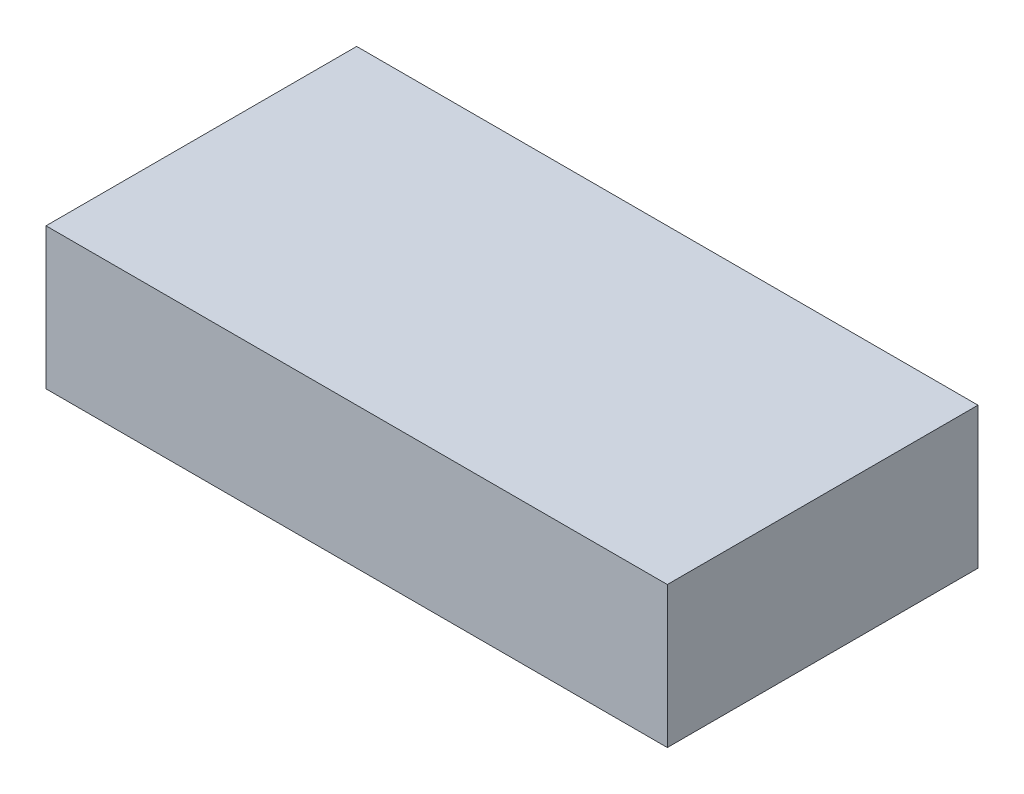
ISO-10303-21;
HEADER;
FILE_DESCRIPTION(('STEP AP214'),'2;1');
FILE_NAME('part.step','',(''),(''),'','','');
FILE_SCHEMA(('AUTOMOTIVE_DESIGN { 1 0 10303 214 1 1 1 1 }'));
ENDSEC;
DATA;
#1=APPLICATION_CONTEXT('core data for automotive mechanical design processes');
#2=APPLICATION_PROTOCOL_DEFINITION('international standard','automotive_design',2000,#1);
#3=PRODUCT_CONTEXT('',#1,'mechanical');
#4=PRODUCT('Part','Part','',(#3));
#5=PRODUCT_RELATED_PRODUCT_CATEGORY('part','',(#4));
#6=PRODUCT_DEFINITION_FORMATION('','',#4);
#7=PRODUCT_DEFINITION_CONTEXT('part definition',#1,'design');
#8=PRODUCT_DEFINITION('design','',#6,#7);
#9=PRODUCT_DEFINITION_SHAPE('','',#8);
#10=(LENGTH_UNIT() NAMED_UNIT(*) SI_UNIT(.MILLI.,.METRE.));
#11=(NAMED_UNIT(*) PLANE_ANGLE_UNIT() SI_UNIT($,.RADIAN.));
#12=(NAMED_UNIT(*) SI_UNIT($,.STERADIAN.) SOLID_ANGLE_UNIT());
#13=UNCERTAINTY_MEASURE_WITH_UNIT(LENGTH_MEASURE(1.E-05),#10,'distance_accuracy_value','');
#14=(GEOMETRIC_REPRESENTATION_CONTEXT(3) GLOBAL_UNCERTAINTY_ASSIGNED_CONTEXT((#13)) GLOBAL_UNIT_ASSIGNED_CONTEXT((#10,
#11,#12)) REPRESENTATION_CONTEXT('',''));
#15=CARTESIAN_POINT('',(0.,0.,0.));
#16=DIRECTION('',(0.,0.,1.));
#17=DIRECTION('',(1.,0.,0.));
#18=AXIS2_PLACEMENT_3D('',#15,#16,#17);
#19=CARTESIAN_POINT('',(-9.32843137254902,5.,-4.09803921568625));
#20=DIRECTION('',(1.,0.,0.));
#21=DIRECTION('',(0.,0.,-1.));
#22=AXIS2_PLACEMENT_3D('',#19,#20,#21);
#23=PLANE('',#22);
#24=DIRECTION('',(0.,0.,1.));
#25=VECTOR('',#24,1.);
#26=CARTESIAN_POINT('',(-9.32843137254902,0.,-4.09803921568625));
#27=LINE('',#26,#25);
#28=CARTESIAN_POINT('',(-9.32843137254902,0.,-4.09803921568625));
#29=VERTEX_POINT('',#28);
#30=CARTESIAN_POINT('',(-9.32843137254902,0.,6.90196078431375));
#31=VERTEX_POINT('',#30);
#32=EDGE_CURVE('E100',#29,#31,#27,.T.);
#33=ORIENTED_EDGE('',*,*,#32,.T.);
#34=DIRECTION('',(0.,-1.,0.));
#35=VECTOR('',#34,1.);
#36=CARTESIAN_POINT('',(-9.32843137254902,5.,6.90196078431375));
#37=LINE('',#36,#35);
#38=CARTESIAN_POINT('',(-9.32843137254902,5.,6.90196078431375));
#39=VERTEX_POINT('',#38);
#40=EDGE_CURVE('E11',#39,#31,#37,.T.);
#41=ORIENTED_EDGE('',*,*,#40,.F.);
#42=DIRECTION('',(0.,0.,1.));
#43=VECTOR('',#42,1.);
#44=CARTESIAN_POINT('',(-9.32843137254902,5.,-4.09803921568625));
#45=LINE('',#44,#43);
#46=CARTESIAN_POINT('',(-9.32843137254902,5.,-4.09803921568625));
#47=VERTEX_POINT('',#46);
#48=EDGE_CURVE('E88',#47,#39,#45,.T.);
#49=ORIENTED_EDGE('',*,*,#48,.F.);
#50=DIRECTION('',(0.,-1.,0.));
#51=VECTOR('',#50,1.);
#52=CARTESIAN_POINT('',(-9.32843137254902,5.,-4.09803921568625));
#53=LINE('',#52,#51);
#54=EDGE_CURVE('E96',#47,#29,#53,.T.);
#55=ORIENTED_EDGE('',*,*,#54,.T.);
#56=EDGE_LOOP('',(#33,#41,#49,#55));
#57=FACE_BOUND('',#56,.T.);
#58=ADVANCED_FACE('F37',(#57),#23,.F.);
#59=CARTESIAN_POINT('',(-9.32843137254902,5.,6.90196078431375));
#60=DIRECTION('',(0.,0.,-1.));
#61=DIRECTION('',(-1.,0.,0.));
#62=AXIS2_PLACEMENT_3D('',#59,#60,#61);
#63=PLANE('',#62);
#64=DIRECTION('',(1.,0.,0.));
#65=VECTOR('',#64,1.);
#66=CARTESIAN_POINT('',(-9.32843137254902,0.,6.90196078431375));
#67=LINE('',#66,#65);
#68=CARTESIAN_POINT('',(12.671568627451,0.,6.90196078431375));
#69=VERTEX_POINT('',#68);
#70=EDGE_CURVE('E92',#31,#69,#67,.T.);
#71=ORIENTED_EDGE('',*,*,#70,.T.);
#72=DIRECTION('',(0.,-1.,0.));
#73=VECTOR('',#72,1.);
#74=CARTESIAN_POINT('',(12.671568627451,5.,6.90196078431375));
#75=LINE('',#74,#73);
#76=CARTESIAN_POINT('',(12.671568627451,5.,6.90196078431375));
#77=VERTEX_POINT('',#76);
#78=EDGE_CURVE('E45',#77,#69,#75,.T.);
#79=ORIENTED_EDGE('',*,*,#78,.F.);
#80=DIRECTION('',(1.,0.,0.));
#81=VECTOR('',#80,1.);
#82=CARTESIAN_POINT('',(-9.32843137254902,5.,6.90196078431375));
#83=LINE('',#82,#81);
#84=EDGE_CURVE('E83',#39,#77,#83,.T.);
#85=ORIENTED_EDGE('',*,*,#84,.F.);
#86=ORIENTED_EDGE('',*,*,#40,.T.);
#87=EDGE_LOOP('',(#71,#79,#85,#86));
#88=FACE_BOUND('',#87,.T.);
#89=ADVANCED_FACE('F91',(#88),#63,.F.);
#90=CARTESIAN_POINT('',(12.671568627451,5.,-4.09803921568625));
#91=DIRECTION('',(-1.,0.,0.));
#92=DIRECTION('',(0.,0.,1.));
#93=AXIS2_PLACEMENT_3D('',#90,#91,#92);
#94=PLANE('',#93);
#95=DIRECTION('',(0.,0.,-1.));
#96=VECTOR('',#95,1.);
#97=CARTESIAN_POINT('',(12.671568627451,0.,-4.09803921568625));
#98=LINE('',#97,#96);
#99=CARTESIAN_POINT('',(12.671568627451,0.,-4.09803921568625));
#100=VERTEX_POINT('',#99);
#101=EDGE_CURVE('E70',#69,#100,#98,.T.);
#102=ORIENTED_EDGE('',*,*,#101,.T.);
#103=DIRECTION('',(0.,-1.,0.));
#104=VECTOR('',#103,1.);
#105=CARTESIAN_POINT('',(12.671568627451,5.,-4.09803921568625));
#106=LINE('',#105,#104);
#107=CARTESIAN_POINT('',(12.671568627451,5.,-4.09803921568625));
#108=VERTEX_POINT('',#107);
#109=EDGE_CURVE('E93',#108,#100,#106,.T.);
#110=ORIENTED_EDGE('',*,*,#109,.F.);
#111=DIRECTION('',(0.,0.,-1.));
#112=VECTOR('',#111,1.);
#113=CARTESIAN_POINT('',(12.671568627451,5.,-4.09803921568625));
#114=LINE('',#113,#112);
#115=EDGE_CURVE('E86',#77,#108,#114,.T.);
#116=ORIENTED_EDGE('',*,*,#115,.F.);
#117=ORIENTED_EDGE('',*,*,#78,.T.);
#118=EDGE_LOOP('',(#102,#110,#116,#117));
#119=FACE_BOUND('',#118,.T.);
#120=ADVANCED_FACE('F94',(#119),#94,.F.);
#121=CARTESIAN_POINT('',(-9.32843137254902,5.,-4.09803921568625));
#122=DIRECTION('',(0.,0.,1.));
#123=DIRECTION('',(1.,0.,0.));
#124=AXIS2_PLACEMENT_3D('',#121,#122,#123);
#125=PLANE('',#124);
#126=DIRECTION('',(-1.,0.,0.));
#127=VECTOR('',#126,1.);
#128=CARTESIAN_POINT('',(-9.32843137254902,0.,-4.09803921568625));
#129=LINE('',#128,#127);
#130=EDGE_CURVE('E76',#100,#29,#129,.T.);
#131=ORIENTED_EDGE('',*,*,#130,.T.);
#132=ORIENTED_EDGE('',*,*,#54,.F.);
#133=DIRECTION('',(-1.,0.,0.));
#134=VECTOR('',#133,1.);
#135=CARTESIAN_POINT('',(-9.32843137254902,5.,-4.09803921568625));
#136=LINE('',#135,#134);
#137=EDGE_CURVE('E53',#108,#47,#136,.T.);
#138=ORIENTED_EDGE('',*,*,#137,.F.);
#139=ORIENTED_EDGE('',*,*,#109,.T.);
#140=EDGE_LOOP('',(#131,#132,#138,#139));
#141=FACE_BOUND('',#140,.T.);
#142=ADVANCED_FACE('F107',(#141),#125,.F.);
#143=CARTESIAN_POINT('',(0.,5.,0.));
#144=DIRECTION('',(0.,1.,0.));
#145=DIRECTION('',(0.,0.,1.));
#146=AXIS2_PLACEMENT_3D('',#143,#144,#145);
#147=PLANE('',#146);
#148=ORIENTED_EDGE('',*,*,#48,.T.);
#149=ORIENTED_EDGE('',*,*,#84,.T.);
#150=ORIENTED_EDGE('',*,*,#115,.T.);
#151=ORIENTED_EDGE('',*,*,#137,.T.);
#152=EDGE_LOOP('',(#148,#149,#150,#151));
#153=FACE_BOUND('',#152,.T.);
#154=ADVANCED_FACE('F84',(#153),#147,.T.);
#155=CARTESIAN_POINT('',(0.,0.,0.));
#156=DIRECTION('',(0.,1.,0.));
#157=DIRECTION('',(0.,0.,1.));
#158=AXIS2_PLACEMENT_3D('',#155,#156,#157);
#159=PLANE('',#158);
#160=ORIENTED_EDGE('',*,*,#32,.F.);
#161=ORIENTED_EDGE('',*,*,#130,.F.);
#162=ORIENTED_EDGE('',*,*,#101,.F.);
#163=ORIENTED_EDGE('',*,*,#70,.F.);
#164=EDGE_LOOP('',(#160,#161,#162,#163));
#165=FACE_BOUND('',#164,.T.);
#166=ADVANCED_FACE('F110',(#165),#159,.F.);
#167=CLOSED_SHELL('',(#58,#89,#120,#142,#154,#166));
#168=MANIFOLD_SOLID_BREP('B2',#167);
#169=ADVANCED_BREP_SHAPE_REPRESENTATION('',(#18,#168),#14);
#170=SHAPE_DEFINITION_REPRESENTATION(#9,#169);
ENDSEC;
END-ISO-10303-21;
